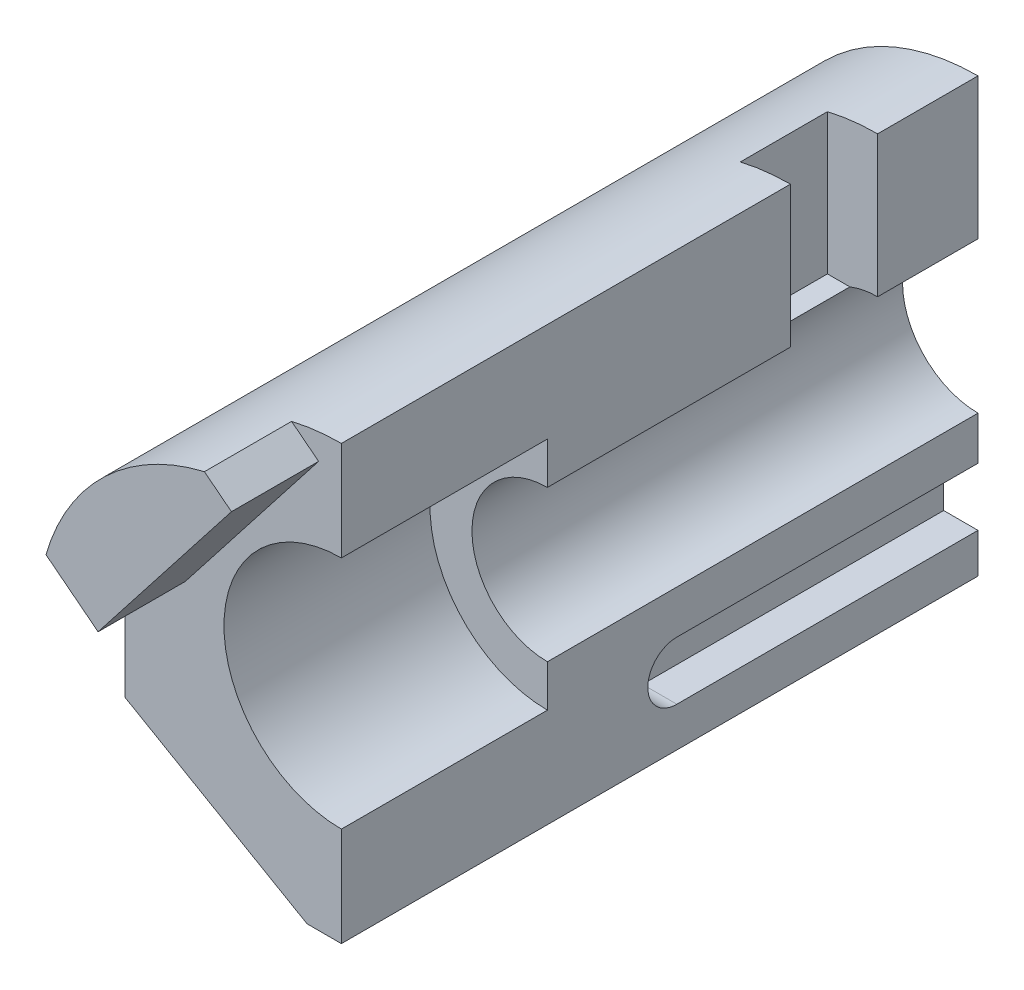
ISO-10303-21;
HEADER;
FILE_DESCRIPTION(('STEP AP214'),'2;1');
FILE_NAME('part.step','',(''),(''),'','','');
FILE_SCHEMA(('AUTOMOTIVE_DESIGN { 1 0 10303 214 1 1 1 1 }'));
ENDSEC;
DATA;
#1=APPLICATION_CONTEXT('core data for automotive mechanical design processes');
#2=APPLICATION_PROTOCOL_DEFINITION('international standard','automotive_design',2000,#1);
#3=PRODUCT_CONTEXT('',#1,'mechanical');
#4=PRODUCT('Part','Part','',(#3));
#5=PRODUCT_RELATED_PRODUCT_CATEGORY('part','',(#4));
#6=PRODUCT_DEFINITION_FORMATION('','',#4);
#7=PRODUCT_DEFINITION_CONTEXT('part definition',#1,'design');
#8=PRODUCT_DEFINITION('design','',#6,#7);
#9=PRODUCT_DEFINITION_SHAPE('','',#8);
#10=(LENGTH_UNIT() NAMED_UNIT(*) SI_UNIT(.MILLI.,.METRE.));
#11=(NAMED_UNIT(*) PLANE_ANGLE_UNIT() SI_UNIT($,.RADIAN.));
#12=(NAMED_UNIT(*) SI_UNIT($,.STERADIAN.) SOLID_ANGLE_UNIT());
#13=UNCERTAINTY_MEASURE_WITH_UNIT(LENGTH_MEASURE(1.E-05),#10,'distance_accuracy_value','');
#14=(GEOMETRIC_REPRESENTATION_CONTEXT(3) GLOBAL_UNCERTAINTY_ASSIGNED_CONTEXT((#13)) GLOBAL_UNIT_ASSIGNED_CONTEXT((#10,
#11,#12)) REPRESENTATION_CONTEXT('',''));
#15=CARTESIAN_POINT('',(0.,0.,0.));
#16=DIRECTION('',(0.,0.,1.));
#17=DIRECTION('',(1.,0.,0.));
#18=AXIS2_PLACEMENT_3D('',#15,#16,#17);
#19=CARTESIAN_POINT('',(0.,82.,-241.));
#20=DIRECTION('',(1.,0.,0.));
#21=DIRECTION('',(0.,1.,0.));
#22=AXIS2_PLACEMENT_3D('',#19,#20,#21);
#23=PLANE('',#22);
#24=DIRECTION('',(0.,-1.,0.));
#25=VECTOR('',#24,1.);
#26=CARTESIAN_POINT('',(0.,82.,-170.));
#27=LINE('',#26,#25);
#28=CARTESIAN_POINT('',(0.,82.,-170.));
#29=VERTEX_POINT('',#28);
#30=CARTESIAN_POINT('',(0.,28.575,-170.));
#31=VERTEX_POINT('',#30);
#32=EDGE_CURVE('E244',#29,#31,#27,.T.);
#33=ORIENTED_EDGE('',*,*,#32,.F.);
#34=DIRECTION('',(0.,0.,1.));
#35=VECTOR('',#34,1.);
#36=CARTESIAN_POINT('',(0.,82.,-241.));
#37=LINE('',#36,#35);
#38=CARTESIAN_POINT('',(0.,82.,0.));
#39=VERTEX_POINT('',#38);
#40=EDGE_CURVE('E402',#29,#39,#37,.T.);
#41=ORIENTED_EDGE('',*,*,#40,.T.);
#42=DIRECTION('',(0.,1.,0.));
#43=VECTOR('',#42,1.);
#44=CARTESIAN_POINT('',(0.,82.,0.));
#45=LINE('',#44,#43);
#46=CARTESIAN_POINT('',(0.,44.45,0.));
#47=VERTEX_POINT('',#46);
#48=EDGE_CURVE('E328',#47,#39,#45,.T.);
#49=ORIENTED_EDGE('',*,*,#48,.F.);
#50=DIRECTION('',(0.,0.,1.));
#51=VECTOR('',#50,1.);
#52=CARTESIAN_POINT('',(0.,44.45,-78.));
#53=LINE('',#52,#51);
#54=CARTESIAN_POINT('',(0.,44.45,-78.));
#55=VERTEX_POINT('',#54);
#56=EDGE_CURVE('E319',#55,#47,#53,.T.);
#57=ORIENTED_EDGE('',*,*,#56,.F.);
#58=DIRECTION('',(0.,-1.,0.));
#59=VECTOR('',#58,1.);
#60=CARTESIAN_POINT('',(0.,44.45,-78.));
#61=LINE('',#60,#59);
#62=CARTESIAN_POINT('',(0.,28.575,-78.));
#63=VERTEX_POINT('',#62);
#64=EDGE_CURVE('E303',#55,#63,#61,.T.);
#65=ORIENTED_EDGE('',*,*,#64,.T.);
#66=DIRECTION('',(0.,0.,1.));
#67=VECTOR('',#66,1.);
#68=CARTESIAN_POINT('',(0.,28.575,-241.));
#69=LINE('',#68,#67);
#70=EDGE_CURVE('E358',#31,#63,#69,.T.);
#71=ORIENTED_EDGE('',*,*,#70,.F.);
#72=EDGE_LOOP('',(#33,#41,#49,#57,#65,#71));
#73=FACE_BOUND('',#72,.T.);
#74=ADVANCED_FACE('F42',(#73),#23,.T.);
#75=CARTESIAN_POINT('',(0.,0.,-241.));
#76=DIRECTION('',(0.,0.,1.));
#77=DIRECTION('',(1.,0.,0.));
#78=AXIS2_PLACEMENT_3D('',#75,#76,#77);
#79=CYLINDRICAL_SURFACE('',#78,28.575);
#80=CARTESIAN_POINT('',(0.,0.,-170.));
#81=DIRECTION('',(0.,0.,1.));
#82=DIRECTION('',(1.,0.,0.));
#83=AXIS2_PLACEMENT_3D('',#80,#81,#82);
#84=CIRCLE('',#83,28.575);
#85=CARTESIAN_POINT('',(-10.5023806824929,26.575,-170.));
#86=VERTEX_POINT('',#85);
#87=EDGE_CURVE('E241',#31,#86,#84,.T.);
#88=ORIENTED_EDGE('',*,*,#87,.F.);
#89=ORIENTED_EDGE('',*,*,#70,.T.);
#90=CARTESIAN_POINT('',(0.,0.,-78.));
#91=DIRECTION('',(0.,0.,1.));
#92=DIRECTION('',(1.,0.,0.));
#93=AXIS2_PLACEMENT_3D('',#90,#91,#92);
#94=CIRCLE('',#93,28.575);
#95=CARTESIAN_POINT('',(0.,-28.575,-78.));
#96=VERTEX_POINT('',#95);
#97=EDGE_CURVE('E307',#63,#96,#94,.T.);
#98=ORIENTED_EDGE('',*,*,#97,.T.);
#99=DIRECTION('',(0.,0.,1.));
#100=VECTOR('',#99,1.);
#101=CARTESIAN_POINT('',(0.,-28.575,-241.));
#102=LINE('',#101,#100);
#103=CARTESIAN_POINT('',(0.,-28.575,-241.));
#104=VERTEX_POINT('',#103);
#105=EDGE_CURVE('E381',#104,#96,#102,.T.);
#106=ORIENTED_EDGE('',*,*,#105,.F.);
#107=CARTESIAN_POINT('',(0.,0.,-241.));
#108=DIRECTION('',(0.,0.,-1.));
#109=DIRECTION('',(1.,0.,0.));
#110=AXIS2_PLACEMENT_3D('',#107,#108,#109);
#111=CIRCLE('',#110,28.575);
#112=CARTESIAN_POINT('',(0.,28.575,-241.));
#113=VERTEX_POINT('',#112);
#114=EDGE_CURVE('E329',#104,#113,#111,.T.);
#115=ORIENTED_EDGE('',*,*,#114,.T.);
#116=CARTESIAN_POINT('',(0.,28.575,-203.));
#117=VERTEX_POINT('',#116);
#118=EDGE_CURVE('E403',#113,#117,#69,.T.);
#119=ORIENTED_EDGE('',*,*,#118,.T.);
#120=CARTESIAN_POINT('',(0.,0.,-203.));
#121=DIRECTION('',(0.,0.,-1.));
#122=DIRECTION('',(-1.,0.,0.));
#123=AXIS2_PLACEMENT_3D('',#120,#121,#122);
#124=CIRCLE('',#123,28.575);
#125=CARTESIAN_POINT('',(-10.5023806824929,26.575,-203.));
#126=VERTEX_POINT('',#125);
#127=EDGE_CURVE('E238',#126,#117,#124,.T.);
#128=ORIENTED_EDGE('',*,*,#127,.F.);
#129=DIRECTION('',(0.,0.,1.));
#130=VECTOR('',#129,1.);
#131=CARTESIAN_POINT('',(-10.5023806824929,26.575,-241.));
#132=LINE('',#131,#130);
#133=EDGE_CURVE('E11',#126,#86,#132,.T.);
#134=ORIENTED_EDGE('',*,*,#133,.T.);
#135=EDGE_LOOP('',(#88,#89,#98,#106,#115,#119,#128,#134));
#136=FACE_BOUND('',#135,.T.);
#137=ADVANCED_FACE('F44',(#136),#79,.F.);
#138=CARTESIAN_POINT('',(0.,-28.575,-241.));
#139=DIRECTION('',(1.,0.,0.));
#140=DIRECTION('',(0.,1.,0.));
#141=AXIS2_PLACEMENT_3D('',#138,#139,#140);
#142=PLANE('',#141);
#143=DIRECTION('',(0.,0.,-1.));
#144=VECTOR('',#143,1.);
#145=CARTESIAN_POINT('',(0.,-67.,-127.));
#146=LINE('',#145,#144);
#147=CARTESIAN_POINT('',(0.,-67.,-127.));
#148=VERTEX_POINT('',#147);
#149=CARTESIAN_POINT('',(0.,-67.,-241.));
#150=VERTEX_POINT('',#149);
#151=EDGE_CURVE('E210',#148,#150,#146,.T.);
#152=ORIENTED_EDGE('',*,*,#151,.F.);
#153=CARTESIAN_POINT('',(0.,-56.,-127.));
#154=DIRECTION('',(1.,0.,0.));
#155=DIRECTION('',(0.,1.,0.));
#156=AXIS2_PLACEMENT_3D('',#153,#154,#155);
#157=CIRCLE('',#156,11.);
#158=CARTESIAN_POINT('',(0.,-45.,-127.));
#159=VERTEX_POINT('',#158);
#160=EDGE_CURVE('E452',#159,#148,#157,.T.);
#161=ORIENTED_EDGE('',*,*,#160,.F.);
#162=DIRECTION('',(0.,0.,1.));
#163=VECTOR('',#162,1.);
#164=CARTESIAN_POINT('',(0.,-45.,-241.));
#165=LINE('',#164,#163);
#166=CARTESIAN_POINT('',(0.,-45.,-241.));
#167=VERTEX_POINT('',#166);
#168=EDGE_CURVE('E455',#167,#159,#165,.T.);
#169=ORIENTED_EDGE('',*,*,#168,.F.);
#170=DIRECTION('',(0.,1.,0.));
#171=VECTOR('',#170,1.);
#172=CARTESIAN_POINT('',(0.,-28.575,-241.));
#173=LINE('',#172,#171);
#174=EDGE_CURVE('E215',#167,#104,#173,.T.);
#175=ORIENTED_EDGE('',*,*,#174,.T.);
#176=ORIENTED_EDGE('',*,*,#105,.T.);
#177=DIRECTION('',(0.,-1.,0.));
#178=VECTOR('',#177,1.);
#179=CARTESIAN_POINT('',(0.,-28.575,-78.));
#180=LINE('',#179,#178);
#181=CARTESIAN_POINT('',(0.,-44.45,-78.));
#182=VERTEX_POINT('',#181);
#183=EDGE_CURVE('E311',#96,#182,#180,.T.);
#184=ORIENTED_EDGE('',*,*,#183,.T.);
#185=DIRECTION('',(0.,0.,1.));
#186=VECTOR('',#185,1.);
#187=CARTESIAN_POINT('',(0.,-44.45,-78.));
#188=LINE('',#187,#186);
#189=CARTESIAN_POINT('',(0.,-44.45,0.));
#190=VERTEX_POINT('',#189);
#191=EDGE_CURVE('E324',#182,#190,#188,.T.);
#192=ORIENTED_EDGE('',*,*,#191,.T.);
#193=DIRECTION('',(0.,1.,0.));
#194=VECTOR('',#193,1.);
#195=CARTESIAN_POINT('',(0.,-28.575,0.));
#196=LINE('',#195,#194);
#197=CARTESIAN_POINT('',(0.,-82.,0.));
#198=VERTEX_POINT('',#197);
#199=EDGE_CURVE('E334',#198,#190,#196,.T.);
#200=ORIENTED_EDGE('',*,*,#199,.F.);
#201=DIRECTION('',(0.,0.,1.));
#202=VECTOR('',#201,1.);
#203=CARTESIAN_POINT('',(0.,-82.,-241.));
#204=LINE('',#203,#202);
#205=CARTESIAN_POINT('',(0.,-82.,-241.));
#206=VERTEX_POINT('',#205);
#207=EDGE_CURVE('E385',#206,#198,#204,.T.);
#208=ORIENTED_EDGE('',*,*,#207,.F.);
#209=EDGE_CURVE('E354',#206,#150,#173,.T.);
#210=ORIENTED_EDGE('',*,*,#209,.T.);
#211=EDGE_LOOP('',(#152,#161,#169,#175,#176,#184,#192,#200,#208,#210));
#212=FACE_BOUND('',#211,.T.);
#213=ADVANCED_FACE('F465',(#212),#142,.T.);
#214=CARTESIAN_POINT('',(0.,-82.,-241.));
#215=DIRECTION('',(0.,-1.,0.));
#216=DIRECTION('',(0.,0.,-1.));
#217=AXIS2_PLACEMENT_3D('',#214,#215,#216);
#218=PLANE('',#217);
#219=DIRECTION('',(1.,0.,0.));
#220=VECTOR('',#219,1.);
#221=CARTESIAN_POINT('',(0.,-82.,0.));
#222=LINE('',#221,#220);
#223=CARTESIAN_POINT('',(-13.,-82.,0.));
#224=VERTEX_POINT('',#223);
#225=EDGE_CURVE('E374',#224,#198,#222,.T.);
#226=ORIENTED_EDGE('',*,*,#225,.F.);
#227=DIRECTION('',(0.,0.,1.));
#228=VECTOR('',#227,1.);
#229=CARTESIAN_POINT('',(-13.,-82.,-241.));
#230=LINE('',#229,#228);
#231=CARTESIAN_POINT('',(-13.,-82.,-241.));
#232=VERTEX_POINT('',#231);
#233=EDGE_CURVE('E388',#232,#224,#230,.T.);
#234=ORIENTED_EDGE('',*,*,#233,.F.);
#235=DIRECTION('',(1.,0.,0.));
#236=VECTOR('',#235,1.);
#237=CARTESIAN_POINT('',(0.,-82.,-241.));
#238=LINE('',#237,#236);
#239=EDGE_CURVE('E350',#232,#206,#238,.T.);
#240=ORIENTED_EDGE('',*,*,#239,.T.);
#241=ORIENTED_EDGE('',*,*,#207,.T.);
#242=EDGE_LOOP('',(#226,#234,#240,#241));
#243=FACE_BOUND('',#242,.T.);
#244=ADVANCED_FACE('F470',(#243),#218,.T.);
#245=CARTESIAN_POINT('',(-13.,-82.,-241.));
#246=DIRECTION('',(-0.500000000000001,-0.866025403784438,0.));
#247=DIRECTION('',(0.866025403784438,-0.500000000000001,0.));
#248=AXIS2_PLACEMENT_3D('',#245,#246,#247);
#249=PLANE('',#248);
#250=DIRECTION('',(0.866025403784438,-0.500000000000001,0.));
#251=VECTOR('',#250,1.);
#252=CARTESIAN_POINT('',(-13.,-82.,0.));
#253=LINE('',#252,#251);
#254=CARTESIAN_POINT('',(-82.,-42.1628314259157,0.));
#255=VERTEX_POINT('',#254);
#256=EDGE_CURVE('E370',#255,#224,#253,.T.);
#257=ORIENTED_EDGE('',*,*,#256,.F.);
#258=DIRECTION('',(0.,0.,1.));
#259=VECTOR('',#258,1.);
#260=CARTESIAN_POINT('',(-82.,-42.1628314259157,-241.));
#261=LINE('',#260,#259);
#262=CARTESIAN_POINT('',(-82.,-42.1628314259157,-241.));
#263=VERTEX_POINT('',#262);
#264=EDGE_CURVE('E391',#263,#255,#261,.T.);
#265=ORIENTED_EDGE('',*,*,#264,.F.);
#266=DIRECTION('',(0.866025403784438,-0.500000000000001,0.));
#267=VECTOR('',#266,1.);
#268=CARTESIAN_POINT('',(-13.,-82.,-241.));
#269=LINE('',#268,#267);
#270=EDGE_CURVE('E346',#263,#232,#269,.T.);
#271=ORIENTED_EDGE('',*,*,#270,.T.);
#272=ORIENTED_EDGE('',*,*,#233,.T.);
#273=EDGE_LOOP('',(#257,#265,#271,#272));
#274=FACE_BOUND('',#273,.T.);
#275=ADVANCED_FACE('F472',(#274),#249,.T.);
#276=CARTESIAN_POINT('',(-82.,-42.1628314259157,-241.));
#277=DIRECTION('',(-1.,0.,0.));
#278=DIRECTION('',(0.,0.,1.));
#279=AXIS2_PLACEMENT_3D('',#276,#277,#278);
#280=PLANE('',#279);
#281=DIRECTION('',(0.,-1.,0.));
#282=VECTOR('',#281,1.);
#283=CARTESIAN_POINT('',(-82.,-42.1628314259157,0.));
#284=LINE('',#283,#282);
#285=CARTESIAN_POINT('',(-82.,0.,0.));
#286=VERTEX_POINT('',#285);
#287=EDGE_CURVE('E366',#286,#255,#284,.T.);
#288=ORIENTED_EDGE('',*,*,#287,.F.);
#289=DIRECTION('',(0.,0.,1.));
#290=VECTOR('',#289,1.);
#291=CARTESIAN_POINT('',(-82.,0.,-241.));
#292=LINE('',#291,#290);
#293=CARTESIAN_POINT('',(-82.,0.,-241.));
#294=VERTEX_POINT('',#293);
#295=EDGE_CURVE('E394',#294,#286,#292,.T.);
#296=ORIENTED_EDGE('',*,*,#295,.F.);
#297=DIRECTION('',(0.,-1.,0.));
#298=VECTOR('',#297,1.);
#299=CARTESIAN_POINT('',(-82.,-42.1628314259157,-241.));
#300=LINE('',#299,#298);
#301=EDGE_CURVE('E342',#294,#263,#300,.T.);
#302=ORIENTED_EDGE('',*,*,#301,.T.);
#303=ORIENTED_EDGE('',*,*,#264,.T.);
#304=EDGE_LOOP('',(#288,#296,#302,#303));
#305=FACE_BOUND('',#304,.T.);
#306=ADVANCED_FACE('F440',(#305),#280,.T.);
#307=CARTESIAN_POINT('',(0.,0.,-241.));
#308=DIRECTION('',(0.,0.,1.));
#309=DIRECTION('',(1.,0.,0.));
#310=AXIS2_PLACEMENT_3D('',#307,#308,#309);
#311=CYLINDRICAL_SURFACE('',#310,82.);
#312=CARTESIAN_POINT('',(0.,0.,-170.));
#313=DIRECTION('',(0.,0.,1.));
#314=DIRECTION('',(1.,0.,0.));
#315=AXIS2_PLACEMENT_3D('',#312,#313,#314);
#316=CIRCLE('',#315,82.);
#317=CARTESIAN_POINT('',(-19.,79.76841480185,-170.));
#318=VERTEX_POINT('',#317);
#319=EDGE_CURVE('E261',#318,#29,#316,.F.);
#320=ORIENTED_EDGE('',*,*,#319,.F.);
#321=DIRECTION('',(0.,0.,1.));
#322=VECTOR('',#321,1.);
#323=CARTESIAN_POINT('',(-19.,79.76841480185,-241.));
#324=LINE('',#323,#322);
#325=CARTESIAN_POINT('',(-19.,79.76841480185,-203.));
#326=VERTEX_POINT('',#325);
#327=EDGE_CURVE('E51',#318,#326,#324,.F.);
#328=ORIENTED_EDGE('',*,*,#327,.T.);
#329=CARTESIAN_POINT('',(0.,0.,-203.));
#330=DIRECTION('',(0.,0.,-1.));
#331=DIRECTION('',(-1.,0.,0.));
#332=AXIS2_PLACEMENT_3D('',#329,#330,#331);
#333=CIRCLE('',#332,82.);
#334=CARTESIAN_POINT('',(0.,82.,-203.));
#335=VERTEX_POINT('',#334);
#336=EDGE_CURVE('E253',#335,#326,#333,.F.);
#337=ORIENTED_EDGE('',*,*,#336,.F.);
#338=CARTESIAN_POINT('',(0.,82.,-241.));
#339=VERTEX_POINT('',#338);
#340=EDGE_CURVE('E398',#339,#335,#37,.T.);
#341=ORIENTED_EDGE('',*,*,#340,.F.);
#342=CARTESIAN_POINT('',(0.,0.,-241.));
#343=DIRECTION('',(0.,0.,1.));
#344=DIRECTION('',(-1.,0.,0.));
#345=AXIS2_PLACEMENT_3D('',#342,#343,#344);
#346=CIRCLE('',#345,82.);
#347=EDGE_CURVE('E338',#339,#294,#346,.T.);
#348=ORIENTED_EDGE('',*,*,#347,.T.);
#349=ORIENTED_EDGE('',*,*,#295,.T.);
#350=CARTESIAN_POINT('',(0.,0.,0.));
#351=DIRECTION('',(0.,0.,1.));
#352=DIRECTION('',(-1.,0.,0.));
#353=AXIS2_PLACEMENT_3D('',#350,#351,#352);
#354=CIRCLE('',#353,82.);
#355=CARTESIAN_POINT('',(-78.8242136086105,22.5996316116911,0.));
#356=VERTEX_POINT('',#355);
#357=EDGE_CURVE('E362',#356,#286,#354,.T.);
#358=ORIENTED_EDGE('',*,*,#357,.F.);
#359=DIRECTION('',(0.,0.,-1.));
#360=VECTOR('',#359,1.);
#361=CARTESIAN_POINT('',(-78.8242136086105,22.5996316116911,33.));
#362=LINE('',#361,#360);
#363=CARTESIAN_POINT('',(-78.8242136086105,22.5996316116911,33.));
#364=VERTEX_POINT('',#363);
#365=EDGE_CURVE('E298',#364,#356,#362,.T.);
#366=ORIENTED_EDGE('',*,*,#365,.F.);
#367=CARTESIAN_POINT('',(0.,0.,33.));
#368=DIRECTION('',(0.,0.,1.));
#369=DIRECTION('',(1.,0.,0.));
#370=AXIS2_PLACEMENT_3D('',#367,#368,#369);
#371=CIRCLE('',#370,82.);
#372=CARTESIAN_POINT('',(-18.8518280728488,79.8035624412329,33.));
#373=VERTEX_POINT('',#372);
#374=EDGE_CURVE('E265',#373,#364,#371,.T.);
#375=ORIENTED_EDGE('',*,*,#374,.F.);
#376=DIRECTION('',(0.,0.,-1.));
#377=VECTOR('',#376,1.);
#378=CARTESIAN_POINT('',(-18.8518280728488,79.8035624412329,33.));
#379=LINE('',#378,#377);
#380=CARTESIAN_POINT('',(-18.8518280728488,79.8035624412329,0.));
#381=VERTEX_POINT('',#380);
#382=EDGE_CURVE('E278',#373,#381,#379,.T.);
#383=ORIENTED_EDGE('',*,*,#382,.T.);
#384=EDGE_CURVE('E363',#39,#381,#354,.T.);
#385=ORIENTED_EDGE('',*,*,#384,.F.);
#386=ORIENTED_EDGE('',*,*,#40,.F.);
#387=EDGE_LOOP('',(#320,#328,#337,#341,#348,#349,#358,#366,#375,#383,#385,#386));
#388=FACE_BOUND('',#387,.T.);
#389=ADVANCED_FACE('F411',(#388),#311,.T.);
#390=DIRECTION('',(0.,1.,0.));
#391=VECTOR('',#390,1.);
#392=CARTESIAN_POINT('',(0.,82.,-203.));
#393=LINE('',#392,#391);
#394=EDGE_CURVE('E249',#117,#335,#393,.T.);
#395=ORIENTED_EDGE('',*,*,#394,.F.);
#396=ORIENTED_EDGE('',*,*,#118,.F.);
#397=DIRECTION('',(0.,1.,0.));
#398=VECTOR('',#397,1.);
#399=CARTESIAN_POINT('',(0.,82.,-241.));
#400=LINE('',#399,#398);
#401=EDGE_CURVE('E333',#113,#339,#400,.T.);
#402=ORIENTED_EDGE('',*,*,#401,.T.);
#403=ORIENTED_EDGE('',*,*,#340,.T.);
#404=EDGE_LOOP('',(#395,#396,#402,#403));
#405=FACE_BOUND('',#404,.T.);
#406=ADVANCED_FACE('F432',(#405),#23,.T.);
#407=CARTESIAN_POINT('',(0.,0.,-241.));
#408=DIRECTION('',(0.,0.,1.));
#409=DIRECTION('',(1.,0.,0.));
#410=AXIS2_PLACEMENT_3D('',#407,#408,#409);
#411=PLANE('',#410);
#412=DIRECTION('',(0.,1.,0.));
#413=VECTOR('',#412,1.);
#414=CARTESIAN_POINT('',(-13.,-45.,-241.));
#415=LINE('',#414,#413);
#416=CARTESIAN_POINT('',(-13.,-67.,-241.));
#417=VERTEX_POINT('',#416);
#418=CARTESIAN_POINT('',(-13.,-45.,-241.));
#419=VERTEX_POINT('',#418);
#420=EDGE_CURVE('E203',#417,#419,#415,.T.);
#421=ORIENTED_EDGE('',*,*,#420,.F.);
#422=DIRECTION('',(1.,0.,0.));
#423=VECTOR('',#422,1.);
#424=CARTESIAN_POINT('',(-13.,-67.,-241.));
#425=LINE('',#424,#423);
#426=EDGE_CURVE('E230',#417,#150,#425,.T.);
#427=ORIENTED_EDGE('',*,*,#426,.T.);
#428=ORIENTED_EDGE('',*,*,#209,.F.);
#429=ORIENTED_EDGE('',*,*,#239,.F.);
#430=ORIENTED_EDGE('',*,*,#270,.F.);
#431=ORIENTED_EDGE('',*,*,#301,.F.);
#432=ORIENTED_EDGE('',*,*,#347,.F.);
#433=ORIENTED_EDGE('',*,*,#401,.F.);
#434=ORIENTED_EDGE('',*,*,#114,.F.);
#435=ORIENTED_EDGE('',*,*,#174,.F.);
#436=DIRECTION('',(1.,0.,0.));
#437=VECTOR('',#436,1.);
#438=CARTESIAN_POINT('',(-13.,-45.,-241.));
#439=LINE('',#438,#437);
#440=EDGE_CURVE('E197',#419,#167,#439,.T.);
#441=ORIENTED_EDGE('',*,*,#440,.F.);
#442=EDGE_LOOP('',(#421,#427,#428,#429,#430,#431,#432,#433,#434,#435,#441));
#443=FACE_BOUND('',#442,.T.);
#444=ADVANCED_FACE('F213',(#443),#411,.F.);
#445=CARTESIAN_POINT('',(0.,0.,0.));
#446=DIRECTION('',(0.,0.,1.));
#447=DIRECTION('',(1.,0.,0.));
#448=AXIS2_PLACEMENT_3D('',#445,#446,#447);
#449=PLANE('',#448);
#450=DIRECTION('',(-0.78801075360672,0.615661475325661,0.));
#451=VECTOR('',#450,1.);
#452=CARTESIAN_POINT('',(-18.8518280728488,79.8035624412329,0.));
#453=LINE('',#452,#451);
#454=CARTESIAN_POINT('',(-8.61759968975226,71.8077069071324,0.));
#455=VERTEX_POINT('',#454);
#456=EDGE_CURVE('E66',#455,#381,#453,.T.);
#457=ORIENTED_EDGE('',*,*,#456,.F.);
#458=DIRECTION('',(0.615661475325653,0.788010753606726,0.));
#459=VECTOR('',#458,1.);
#460=CARTESIAN_POINT('',(-8.61759968975226,71.8077069071324,0.));
#461=LINE('',#460,#459);
#462=CARTESIAN_POINT('',(-59.1018406664558,7.19082511138085,0.));
#463=VERTEX_POINT('',#462);
#464=EDGE_CURVE('E282',#463,#455,#461,.T.);
#465=ORIENTED_EDGE('',*,*,#464,.F.);
#466=DIRECTION('',(0.788010753606726,-0.615661475325654,0.));
#467=VECTOR('',#466,1.);
#468=CARTESIAN_POINT('',(-59.1018406664558,7.19082511138085,0.));
#469=LINE('',#468,#467);
#470=EDGE_CURVE('E264',#356,#463,#469,.T.);
#471=ORIENTED_EDGE('',*,*,#470,.F.);
#472=ORIENTED_EDGE('',*,*,#357,.T.);
#473=ORIENTED_EDGE('',*,*,#287,.T.);
#474=ORIENTED_EDGE('',*,*,#256,.T.);
#475=ORIENTED_EDGE('',*,*,#225,.T.);
#476=ORIENTED_EDGE('',*,*,#199,.T.);
#477=CARTESIAN_POINT('',(0.,0.,0.));
#478=DIRECTION('',(0.,0.,1.));
#479=DIRECTION('',(1.,0.,0.));
#480=AXIS2_PLACEMENT_3D('',#477,#478,#479);
#481=CIRCLE('',#480,44.45);
#482=EDGE_CURVE('E302',#47,#190,#481,.T.);
#483=ORIENTED_EDGE('',*,*,#482,.F.);
#484=ORIENTED_EDGE('',*,*,#48,.T.);
#485=ORIENTED_EDGE('',*,*,#384,.T.);
#486=EDGE_LOOP('',(#457,#465,#471,#472,#473,#474,#475,#476,#483,#484,#485));
#487=FACE_BOUND('',#486,.T.);
#488=ADVANCED_FACE('F442',(#487),#449,.T.);
#489=CARTESIAN_POINT('',(0.,0.,-78.));
#490=DIRECTION('',(0.,0.,1.));
#491=DIRECTION('',(1.,0.,0.));
#492=AXIS2_PLACEMENT_3D('',#489,#490,#491);
#493=CYLINDRICAL_SURFACE('',#492,44.45);
#494=ORIENTED_EDGE('',*,*,#482,.T.);
#495=ORIENTED_EDGE('',*,*,#191,.F.);
#496=CARTESIAN_POINT('',(0.,0.,-78.));
#497=DIRECTION('',(0.,0.,1.));
#498=DIRECTION('',(1.,0.,0.));
#499=AXIS2_PLACEMENT_3D('',#496,#497,#498);
#500=CIRCLE('',#499,44.45);
#501=EDGE_CURVE('E315',#55,#182,#500,.T.);
#502=ORIENTED_EDGE('',*,*,#501,.F.);
#503=ORIENTED_EDGE('',*,*,#56,.T.);
#504=EDGE_LOOP('',(#494,#495,#502,#503));
#505=FACE_BOUND('',#504,.T.);
#506=ADVANCED_FACE('F487',(#505),#493,.F.);
#507=CARTESIAN_POINT('',(0.,0.,-78.));
#508=DIRECTION('',(0.,0.,1.));
#509=DIRECTION('',(1.,0.,0.));
#510=AXIS2_PLACEMENT_3D('',#507,#508,#509);
#511=PLANE('',#510);
#512=ORIENTED_EDGE('',*,*,#64,.F.);
#513=ORIENTED_EDGE('',*,*,#501,.T.);
#514=ORIENTED_EDGE('',*,*,#183,.F.);
#515=ORIENTED_EDGE('',*,*,#97,.F.);
#516=EDGE_LOOP('',(#512,#513,#514,#515));
#517=FACE_BOUND('',#516,.T.);
#518=ADVANCED_FACE('F485',(#517),#511,.T.);
#519=CARTESIAN_POINT('',(-59.1018406664558,7.19082511138085,33.));
#520=DIRECTION('',(0.615661475325654,0.788010753606726,0.));
#521=DIRECTION('',(-0.788010753606726,0.615661475325654,0.));
#522=AXIS2_PLACEMENT_3D('',#519,#520,#521);
#523=PLANE('',#522);
#524=ORIENTED_EDGE('',*,*,#470,.T.);
#525=DIRECTION('',(0.,0.,-1.));
#526=VECTOR('',#525,1.);
#527=CARTESIAN_POINT('',(-59.1018406664558,7.19082511138085,33.));
#528=LINE('',#527,#526);
#529=CARTESIAN_POINT('',(-59.1018406664558,7.19082511138085,33.));
#530=VERTEX_POINT('',#529);
#531=EDGE_CURVE('E294',#530,#463,#528,.T.);
#532=ORIENTED_EDGE('',*,*,#531,.F.);
#533=DIRECTION('',(0.788010753606726,-0.615661475325654,0.));
#534=VECTOR('',#533,1.);
#535=CARTESIAN_POINT('',(-59.1018406664558,7.19082511138085,33.));
#536=LINE('',#535,#534);
#537=EDGE_CURVE('E269',#364,#530,#536,.T.);
#538=ORIENTED_EDGE('',*,*,#537,.F.);
#539=ORIENTED_EDGE('',*,*,#365,.T.);
#540=EDGE_LOOP('',(#524,#532,#538,#539));
#541=FACE_BOUND('',#540,.T.);
#542=ADVANCED_FACE('F494',(#541),#523,.F.);
#543=CARTESIAN_POINT('',(-8.61759968975226,71.8077069071324,33.));
#544=DIRECTION('',(-0.788010753606726,0.615661475325653,0.));
#545=DIRECTION('',(-0.615661475325653,-0.788010753606726,0.));
#546=AXIS2_PLACEMENT_3D('',#543,#544,#545);
#547=PLANE('',#546);
#548=ORIENTED_EDGE('',*,*,#464,.T.);
#549=DIRECTION('',(0.,0.,-1.));
#550=VECTOR('',#549,1.);
#551=CARTESIAN_POINT('',(-8.61759968975226,71.8077069071324,33.));
#552=LINE('',#551,#550);
#553=CARTESIAN_POINT('',(-8.61759968975226,71.8077069071324,33.));
#554=VERTEX_POINT('',#553);
#555=EDGE_CURVE('E290',#554,#455,#552,.T.);
#556=ORIENTED_EDGE('',*,*,#555,.F.);
#557=DIRECTION('',(0.615661475325653,0.788010753606726,0.));
#558=VECTOR('',#557,1.);
#559=CARTESIAN_POINT('',(-8.61759968975226,71.8077069071324,33.));
#560=LINE('',#559,#558);
#561=EDGE_CURVE('E272',#530,#554,#560,.T.);
#562=ORIENTED_EDGE('',*,*,#561,.F.);
#563=ORIENTED_EDGE('',*,*,#531,.T.);
#564=EDGE_LOOP('',(#548,#556,#562,#563));
#565=FACE_BOUND('',#564,.T.);
#566=ADVANCED_FACE('F625',(#565),#547,.F.);
#567=CARTESIAN_POINT('',(-18.8518280728488,79.8035624412329,33.));
#568=DIRECTION('',(-0.615661475325661,-0.78801075360672,0.));
#569=DIRECTION('',(0.78801075360672,-0.615661475325661,0.));
#570=AXIS2_PLACEMENT_3D('',#567,#568,#569);
#571=PLANE('',#570);
#572=ORIENTED_EDGE('',*,*,#456,.T.);
#573=ORIENTED_EDGE('',*,*,#382,.F.);
#574=DIRECTION('',(-0.78801075360672,0.615661475325661,0.));
#575=VECTOR('',#574,1.);
#576=CARTESIAN_POINT('',(-18.8518280728488,79.8035624412329,33.));
#577=LINE('',#576,#575);
#578=EDGE_CURVE('E275',#554,#373,#577,.T.);
#579=ORIENTED_EDGE('',*,*,#578,.F.);
#580=ORIENTED_EDGE('',*,*,#555,.T.);
#581=EDGE_LOOP('',(#572,#573,#579,#580));
#582=FACE_BOUND('',#581,.T.);
#583=ADVANCED_FACE('F616',(#582),#571,.F.);
#584=CARTESIAN_POINT('',(0.,0.,33.));
#585=DIRECTION('',(0.,0.,1.));
#586=DIRECTION('',(1.,0.,0.));
#587=AXIS2_PLACEMENT_3D('',#584,#585,#586);
#588=PLANE('',#587);
#589=ORIENTED_EDGE('',*,*,#374,.T.);
#590=ORIENTED_EDGE('',*,*,#537,.T.);
#591=ORIENTED_EDGE('',*,*,#561,.T.);
#592=ORIENTED_EDGE('',*,*,#578,.T.);
#593=EDGE_LOOP('',(#589,#590,#591,#592));
#594=FACE_BOUND('',#593,.T.);
#595=ADVANCED_FACE('F602',(#594),#588,.T.);
#596=CARTESIAN_POINT('',(-19.,82.,-170.));
#597=DIRECTION('',(0.,0.,1.));
#598=DIRECTION('',(1.,0.,0.));
#599=AXIS2_PLACEMENT_3D('',#596,#597,#598);
#600=PLANE('',#599);
#601=ORIENTED_EDGE('',*,*,#319,.T.);
#602=ORIENTED_EDGE('',*,*,#32,.T.);
#603=ORIENTED_EDGE('',*,*,#87,.T.);
#604=DIRECTION('',(1.,0.,0.));
#605=VECTOR('',#604,1.);
#606=CARTESIAN_POINT('',(-19.,26.575,-170.));
#607=LINE('',#606,#605);
#608=CARTESIAN_POINT('',(-19.,26.575,-170.));
#609=VERTEX_POINT('',#608);
#610=EDGE_CURVE('E225',#609,#86,#607,.T.);
#611=ORIENTED_EDGE('',*,*,#610,.F.);
#612=DIRECTION('',(0.,-1.,0.));
#613=VECTOR('',#612,1.);
#614=CARTESIAN_POINT('',(-19.,82.,-170.));
#615=LINE('',#614,#613);
#616=EDGE_CURVE('E245',#318,#609,#615,.T.);
#617=ORIENTED_EDGE('',*,*,#616,.F.);
#618=EDGE_LOOP('',(#601,#602,#603,#611,#617));
#619=FACE_BOUND('',#618,.T.);
#620=ADVANCED_FACE('F419',(#619),#600,.F.);
#621=CARTESIAN_POINT('',(-19.,82.,-203.));
#622=DIRECTION('',(0.,0.,-1.));
#623=DIRECTION('',(-1.,0.,0.));
#624=AXIS2_PLACEMENT_3D('',#621,#622,#623);
#625=PLANE('',#624);
#626=ORIENTED_EDGE('',*,*,#336,.T.);
#627=DIRECTION('',(0.,1.,0.));
#628=VECTOR('',#627,1.);
#629=CARTESIAN_POINT('',(-19.,82.,-203.));
#630=LINE('',#629,#628);
#631=CARTESIAN_POINT('',(-19.,26.575,-203.));
#632=VERTEX_POINT('',#631);
#633=EDGE_CURVE('E248',#632,#326,#630,.T.);
#634=ORIENTED_EDGE('',*,*,#633,.F.);
#635=DIRECTION('',(-1.,0.,0.));
#636=VECTOR('',#635,1.);
#637=CARTESIAN_POINT('',(0.,26.575,-203.));
#638=LINE('',#637,#636);
#639=EDGE_CURVE('E229',#126,#632,#638,.T.);
#640=ORIENTED_EDGE('',*,*,#639,.F.);
#641=ORIENTED_EDGE('',*,*,#127,.T.);
#642=ORIENTED_EDGE('',*,*,#394,.T.);
#643=EDGE_LOOP('',(#626,#634,#640,#641,#642));
#644=FACE_BOUND('',#643,.T.);
#645=ADVANCED_FACE('F426',(#644),#625,.F.);
#646=CARTESIAN_POINT('',(-19.,0.,0.));
#647=DIRECTION('',(1.,0.,0.));
#648=DIRECTION('',(0.,1.,0.));
#649=AXIS2_PLACEMENT_3D('',#646,#647,#648);
#650=PLANE('',#649);
#651=ORIENTED_EDGE('',*,*,#616,.T.);
#652=DIRECTION('',(0.,0.,1.));
#653=VECTOR('',#652,1.);
#654=CARTESIAN_POINT('',(-19.,26.575,-203.));
#655=LINE('',#654,#653);
#656=EDGE_CURVE('E234',#632,#609,#655,.T.);
#657=ORIENTED_EDGE('',*,*,#656,.F.);
#658=ORIENTED_EDGE('',*,*,#633,.T.);
#659=ORIENTED_EDGE('',*,*,#327,.F.);
#660=EDGE_LOOP('',(#651,#657,#658,#659));
#661=FACE_BOUND('',#660,.T.);
#662=ADVANCED_FACE('F415',(#661),#650,.T.);
#663=CARTESIAN_POINT('',(0.,26.575,0.));
#664=DIRECTION('',(0.,1.,0.));
#665=DIRECTION('',(-1.,0.,0.));
#666=AXIS2_PLACEMENT_3D('',#663,#664,#665);
#667=PLANE('',#666);
#668=ORIENTED_EDGE('',*,*,#639,.T.);
#669=ORIENTED_EDGE('',*,*,#656,.T.);
#670=ORIENTED_EDGE('',*,*,#610,.T.);
#671=ORIENTED_EDGE('',*,*,#133,.F.);
#672=EDGE_LOOP('',(#668,#669,#670,#671));
#673=FACE_BOUND('',#672,.T.);
#674=ADVANCED_FACE('F422',(#673),#667,.T.);
#675=CARTESIAN_POINT('',(-13.,-67.,-127.));
#676=DIRECTION('',(0.,-1.,0.));
#677=DIRECTION('',(1.,0.,0.));
#678=AXIS2_PLACEMENT_3D('',#675,#676,#677);
#679=PLANE('',#678);
#680=ORIENTED_EDGE('',*,*,#151,.T.);
#681=ORIENTED_EDGE('',*,*,#426,.F.);
#682=DIRECTION('',(0.,0.,-1.));
#683=VECTOR('',#682,1.);
#684=CARTESIAN_POINT('',(-13.,-67.,-127.));
#685=LINE('',#684,#683);
#686=CARTESIAN_POINT('',(-13.,-67.,-127.));
#687=VERTEX_POINT('',#686);
#688=EDGE_CURVE('E58',#687,#417,#685,.T.);
#689=ORIENTED_EDGE('',*,*,#688,.F.);
#690=DIRECTION('',(1.,0.,0.));
#691=VECTOR('',#690,1.);
#692=CARTESIAN_POINT('',(-13.,-67.,-127.));
#693=LINE('',#692,#691);
#694=EDGE_CURVE('E220',#687,#148,#693,.T.);
#695=ORIENTED_EDGE('',*,*,#694,.T.);
#696=EDGE_LOOP('',(#680,#681,#689,#695));
#697=FACE_BOUND('',#696,.T.);
#698=ADVANCED_FACE('F460',(#697),#679,.F.);
#699=CARTESIAN_POINT('',(-13.,-56.,-127.));
#700=DIRECTION('',(1.,0.,0.));
#701=DIRECTION('',(0.,1.,0.));
#702=AXIS2_PLACEMENT_3D('',#699,#700,#701);
#703=CYLINDRICAL_SURFACE('',#702,11.);
#704=ORIENTED_EDGE('',*,*,#160,.T.);
#705=ORIENTED_EDGE('',*,*,#694,.F.);
#706=CARTESIAN_POINT('',(-13.,-56.,-127.));
#707=DIRECTION('',(1.,0.,0.));
#708=DIRECTION('',(0.,1.,0.));
#709=AXIS2_PLACEMENT_3D('',#706,#707,#708);
#710=CIRCLE('',#709,11.);
#711=CARTESIAN_POINT('',(-13.,-45.,-127.));
#712=VERTEX_POINT('',#711);
#713=EDGE_CURVE('E202',#712,#687,#710,.T.);
#714=ORIENTED_EDGE('',*,*,#713,.F.);
#715=DIRECTION('',(1.,0.,0.));
#716=VECTOR('',#715,1.);
#717=CARTESIAN_POINT('',(-13.,-45.,-127.));
#718=LINE('',#717,#716);
#719=EDGE_CURVE('E199',#712,#159,#718,.T.);
#720=ORIENTED_EDGE('',*,*,#719,.T.);
#721=EDGE_LOOP('',(#704,#705,#714,#720));
#722=FACE_BOUND('',#721,.T.);
#723=ADVANCED_FACE('F540',(#722),#703,.F.);
#724=CARTESIAN_POINT('',(-13.,-45.,-241.));
#725=DIRECTION('',(0.,1.,0.));
#726=DIRECTION('',(0.,0.,1.));
#727=AXIS2_PLACEMENT_3D('',#724,#725,#726);
#728=PLANE('',#727);
#729=ORIENTED_EDGE('',*,*,#168,.T.);
#730=ORIENTED_EDGE('',*,*,#719,.F.);
#731=DIRECTION('',(0.,0.,1.));
#732=VECTOR('',#731,1.);
#733=CARTESIAN_POINT('',(-13.,-45.,-241.));
#734=LINE('',#733,#732);
#735=EDGE_CURVE('E193',#419,#712,#734,.T.);
#736=ORIENTED_EDGE('',*,*,#735,.F.);
#737=ORIENTED_EDGE('',*,*,#440,.T.);
#738=EDGE_LOOP('',(#729,#730,#736,#737));
#739=FACE_BOUND('',#738,.T.);
#740=ADVANCED_FACE('F195',(#739),#728,.F.);
#741=CARTESIAN_POINT('',(-13.,-56.,-127.));
#742=DIRECTION('',(1.,0.,0.));
#743=DIRECTION('',(0.,1.,0.));
#744=AXIS2_PLACEMENT_3D('',#741,#742,#743);
#745=PLANE('',#744);
#746=ORIENTED_EDGE('',*,*,#420,.T.);
#747=ORIENTED_EDGE('',*,*,#735,.T.);
#748=ORIENTED_EDGE('',*,*,#713,.T.);
#749=ORIENTED_EDGE('',*,*,#688,.T.);
#750=EDGE_LOOP('',(#746,#747,#748,#749));
#751=FACE_BOUND('',#750,.T.);
#752=ADVANCED_FACE('F206',(#751),#745,.T.);
#753=CLOSED_SHELL('',(#74,#137,#213,#244,#275,#306,#389,#406,#444,#488,#506,#518,#542,#566,#583,
#595,#620,#645,#662,#674,#698,#723,#740,#752));
#754=MANIFOLD_SOLID_BREP('B2',#753);
#755=ADVANCED_BREP_SHAPE_REPRESENTATION('',(#18,#754),#14);
#756=SHAPE_DEFINITION_REPRESENTATION(#9,#755);
ENDSEC;
END-ISO-10303-21;
